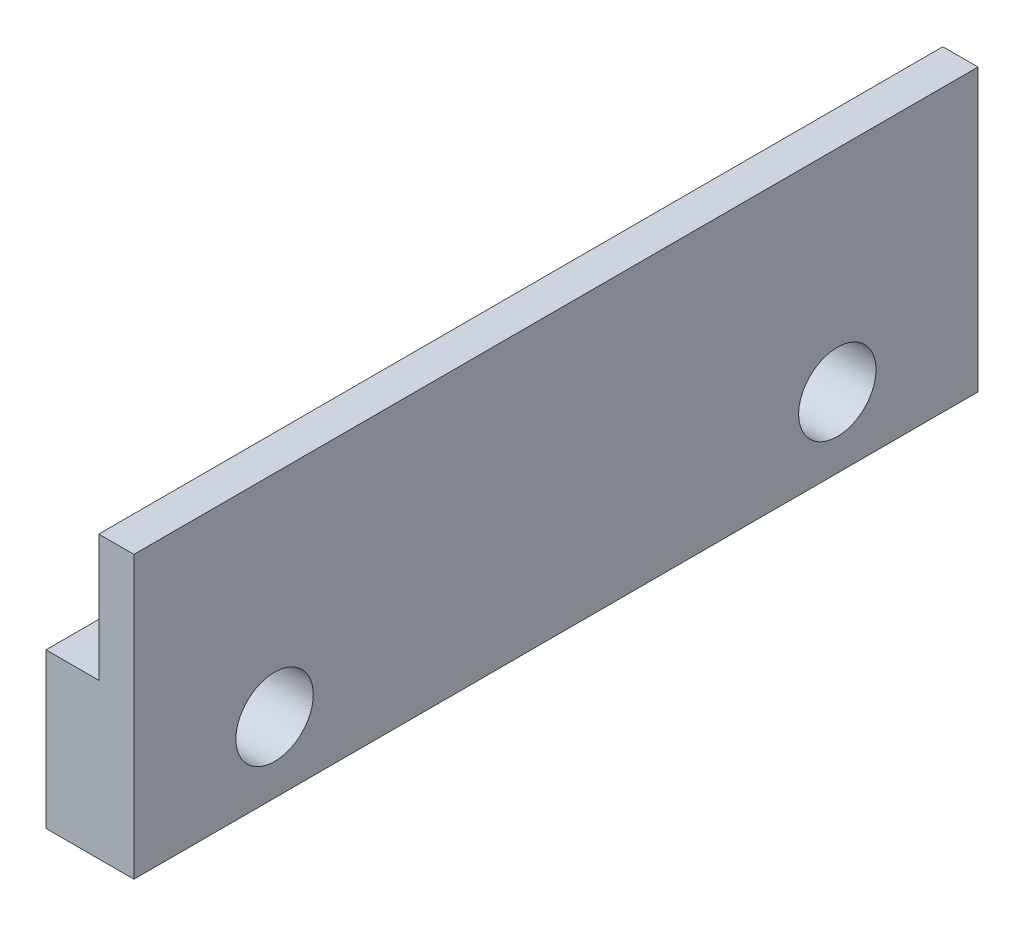
ISO-10303-21;
HEADER;
FILE_DESCRIPTION(('STEP AP214'),'2;1');
FILE_NAME('part.step','',(''),(''),'','','');
FILE_SCHEMA(('AUTOMOTIVE_DESIGN { 1 0 10303 214 1 1 1 1 }'));
ENDSEC;
DATA;
#1=APPLICATION_CONTEXT('core data for automotive mechanical design processes');
#2=APPLICATION_PROTOCOL_DEFINITION('international standard','automotive_design',2000,#1);
#3=PRODUCT_CONTEXT('',#1,'mechanical');
#4=PRODUCT('Part','Part','',(#3));
#5=PRODUCT_RELATED_PRODUCT_CATEGORY('part','',(#4));
#6=PRODUCT_DEFINITION_FORMATION('','',#4);
#7=PRODUCT_DEFINITION_CONTEXT('part definition',#1,'design');
#8=PRODUCT_DEFINITION('design','',#6,#7);
#9=PRODUCT_DEFINITION_SHAPE('','',#8);
#10=(LENGTH_UNIT() NAMED_UNIT(*) SI_UNIT(.MILLI.,.METRE.));
#11=(NAMED_UNIT(*) PLANE_ANGLE_UNIT() SI_UNIT($,.RADIAN.));
#12=(NAMED_UNIT(*) SI_UNIT($,.STERADIAN.) SOLID_ANGLE_UNIT());
#13=UNCERTAINTY_MEASURE_WITH_UNIT(LENGTH_MEASURE(1.E-05),#10,'distance_accuracy_value','');
#14=(GEOMETRIC_REPRESENTATION_CONTEXT(3) GLOBAL_UNCERTAINTY_ASSIGNED_CONTEXT((#13)) GLOBAL_UNIT_ASSIGNED_CONTEXT((#10,
#11,#12)) REPRESENTATION_CONTEXT('',''));
#15=CARTESIAN_POINT('',(0.,0.,0.));
#16=DIRECTION('',(0.,0.,1.));
#17=DIRECTION('',(1.,0.,0.));
#18=AXIS2_PLACEMENT_3D('',#15,#16,#17);
#19=CARTESIAN_POINT('',(6.35,17.2640625,152.4));
#20=DIRECTION('',(-1.,0.,0.));
#21=DIRECTION('',(0.,-1.,0.));
#22=AXIS2_PLACEMENT_3D('',#19,#20,#21);
#23=PLANE('',#22);
#24=CARTESIAN_POINT('',(6.35000000000001,-20.8359375,127.));
#25=DIRECTION('',(1.,0.,0.));
#26=DIRECTION('',(0.,1.,0.));
#27=AXIS2_PLACEMENT_3D('',#24,#25,#26);
#28=CIRCLE('',#27,6.985);
#29=CARTESIAN_POINT('',(6.35000000000001,-13.8509375,127.));
#30=VERTEX_POINT('',#29);
#31=EDGE_CURVE('E182',#30,#30,#28,.T.);
#32=ORIENTED_EDGE('',*,*,#31,.F.);
#33=EDGE_LOOP('',(#32));
#34=FACE_BOUND('',#33,.T.);
#35=CARTESIAN_POINT('',(6.35000000000001,-20.8359375,25.4000000000001));
#36=DIRECTION('',(1.,0.,0.));
#37=DIRECTION('',(0.,-1.,0.));
#38=AXIS2_PLACEMENT_3D('',#35,#36,#37);
#39=CIRCLE('',#38,6.985);
#40=CARTESIAN_POINT('',(6.35000000000001,-27.8209375,25.4000000000001));
#41=VERTEX_POINT('',#40);
#42=EDGE_CURVE('E185',#41,#41,#39,.T.);
#43=ORIENTED_EDGE('',*,*,#42,.F.);
#44=EDGE_LOOP('',(#43));
#45=FACE_BOUND('',#44,.T.);
#46=DIRECTION('',(0.,1.,0.));
#47=VECTOR('',#46,1.);
#48=CARTESIAN_POINT('',(6.35,17.2640625,0.));
#49=LINE('',#48,#47);
#50=CARTESIAN_POINT('',(6.35000000000001,-33.5359375,0.));
#51=VERTEX_POINT('',#50);
#52=CARTESIAN_POINT('',(6.35,17.2640625,0.));
#53=VERTEX_POINT('',#52);
#54=EDGE_CURVE('E128',#51,#53,#49,.T.);
#55=ORIENTED_EDGE('',*,*,#54,.T.);
#56=DIRECTION('',(0.,0.,-1.));
#57=VECTOR('',#56,1.);
#58=CARTESIAN_POINT('',(6.35,17.2640625,152.4));
#59=LINE('',#58,#57);
#60=CARTESIAN_POINT('',(6.35,17.2640625,152.4));
#61=VERTEX_POINT('',#60);
#62=EDGE_CURVE('E11',#61,#53,#59,.T.);
#63=ORIENTED_EDGE('',*,*,#62,.F.);
#64=DIRECTION('',(0.,1.,0.));
#65=VECTOR('',#64,1.);
#66=CARTESIAN_POINT('',(6.35,17.2640625,152.4));
#67=LINE('',#66,#65);
#68=CARTESIAN_POINT('',(6.35000000000001,-33.5359375,152.4));
#69=VERTEX_POINT('',#68);
#70=EDGE_CURVE('E145',#69,#61,#67,.T.);
#71=ORIENTED_EDGE('',*,*,#70,.F.);
#72=DIRECTION('',(0.,0.,-1.));
#73=VECTOR('',#72,1.);
#74=CARTESIAN_POINT('',(6.35000000000001,-33.5359375,152.4));
#75=LINE('',#74,#73);
#76=EDGE_CURVE('E124',#69,#51,#75,.T.);
#77=ORIENTED_EDGE('',*,*,#76,.T.);
#78=EDGE_LOOP('',(#55,#63,#71,#77));
#79=FACE_BOUND('',#78,.T.);
#80=ADVANCED_FACE('F39',(#34,#45,#79),#23,.F.);
#81=CARTESIAN_POINT('',(0.,17.2640625,152.4));
#82=DIRECTION('',(0.,-1.,0.));
#83=DIRECTION('',(0.,0.,-1.));
#84=AXIS2_PLACEMENT_3D('',#81,#82,#83);
#85=PLANE('',#84);
#86=DIRECTION('',(-1.,0.,0.));
#87=VECTOR('',#86,1.);
#88=CARTESIAN_POINT('',(0.,17.2640625,0.));
#89=LINE('',#88,#87);
#90=CARTESIAN_POINT('',(0.,17.2640625,0.));
#91=VERTEX_POINT('',#90);
#92=EDGE_CURVE('E132',#53,#91,#89,.T.);
#93=ORIENTED_EDGE('',*,*,#92,.T.);
#94=DIRECTION('',(0.,0.,-1.));
#95=VECTOR('',#94,1.);
#96=CARTESIAN_POINT('',(0.,17.2640625,152.4));
#97=LINE('',#96,#95);
#98=CARTESIAN_POINT('',(0.,17.2640625,152.4));
#99=VERTEX_POINT('',#98);
#100=EDGE_CURVE('E48',#99,#91,#97,.T.);
#101=ORIENTED_EDGE('',*,*,#100,.F.);
#102=DIRECTION('',(-1.,0.,0.));
#103=VECTOR('',#102,1.);
#104=CARTESIAN_POINT('',(0.,17.2640625,152.4));
#105=LINE('',#104,#103);
#106=EDGE_CURVE('E93',#61,#99,#105,.T.);
#107=ORIENTED_EDGE('',*,*,#106,.F.);
#108=ORIENTED_EDGE('',*,*,#62,.T.);
#109=EDGE_LOOP('',(#93,#101,#107,#108));
#110=FACE_BOUND('',#109,.T.);
#111=ADVANCED_FACE('F174',(#110),#85,.F.);
#112=CARTESIAN_POINT('',(0.,17.2640625,152.4));
#113=DIRECTION('',(1.,0.,0.));
#114=DIRECTION('',(0.,1.,0.));
#115=AXIS2_PLACEMENT_3D('',#112,#113,#114);
#116=PLANE('',#115);
#117=DIRECTION('',(0.,-1.,0.));
#118=VECTOR('',#117,1.);
#119=CARTESIAN_POINT('',(0.,17.2640625,0.));
#120=LINE('',#119,#118);
#121=CARTESIAN_POINT('',(0.,-5.59593749999998,0.));
#122=VERTEX_POINT('',#121);
#123=EDGE_CURVE('E136',#91,#122,#120,.T.);
#124=ORIENTED_EDGE('',*,*,#123,.T.);
#125=DIRECTION('',(0.,0.,-1.));
#126=VECTOR('',#125,1.);
#127=CARTESIAN_POINT('',(0.,-5.59593749999998,152.4));
#128=LINE('',#127,#126);
#129=CARTESIAN_POINT('',(0.,-5.59593749999998,152.4));
#130=VERTEX_POINT('',#129);
#131=EDGE_CURVE('E117',#130,#122,#128,.T.);
#132=ORIENTED_EDGE('',*,*,#131,.F.);
#133=DIRECTION('',(0.,-1.,0.));
#134=VECTOR('',#133,1.);
#135=CARTESIAN_POINT('',(0.,17.2640625,152.4));
#136=LINE('',#135,#134);
#137=EDGE_CURVE('E106',#99,#130,#136,.T.);
#138=ORIENTED_EDGE('',*,*,#137,.F.);
#139=ORIENTED_EDGE('',*,*,#100,.T.);
#140=EDGE_LOOP('',(#124,#132,#138,#139));
#141=FACE_BOUND('',#140,.T.);
#142=ADVANCED_FACE('F155',(#141),#116,.F.);
#143=CARTESIAN_POINT('',(0.,-5.59593749999998,152.4));
#144=DIRECTION('',(0.,-1.,0.));
#145=DIRECTION('',(1.,0.,0.));
#146=AXIS2_PLACEMENT_3D('',#143,#144,#145);
#147=PLANE('',#146);
#148=DIRECTION('',(-1.,0.,0.));
#149=VECTOR('',#148,1.);
#150=CARTESIAN_POINT('',(0.,-5.59593749999998,0.));
#151=LINE('',#150,#149);
#152=CARTESIAN_POINT('',(-9.525,-5.59593749999998,0.));
#153=VERTEX_POINT('',#152);
#154=EDGE_CURVE('E115',#122,#153,#151,.T.);
#155=ORIENTED_EDGE('',*,*,#154,.T.);
#156=DIRECTION('',(0.,0.,-1.));
#157=VECTOR('',#156,1.);
#158=CARTESIAN_POINT('',(-9.525,-5.59593749999998,152.4));
#159=LINE('',#158,#157);
#160=CARTESIAN_POINT('',(-9.525,-5.59593749999998,152.4));
#161=VERTEX_POINT('',#160);
#162=EDGE_CURVE('E112',#161,#153,#159,.T.);
#163=ORIENTED_EDGE('',*,*,#162,.F.);
#164=DIRECTION('',(-1.,0.,0.));
#165=VECTOR('',#164,1.);
#166=CARTESIAN_POINT('',(0.,-5.59593749999998,152.4));
#167=LINE('',#166,#165);
#168=EDGE_CURVE('E100',#130,#161,#167,.T.);
#169=ORIENTED_EDGE('',*,*,#168,.F.);
#170=ORIENTED_EDGE('',*,*,#131,.T.);
#171=EDGE_LOOP('',(#155,#163,#169,#170));
#172=FACE_BOUND('',#171,.T.);
#173=ADVANCED_FACE('F113',(#172),#147,.F.);
#174=CARTESIAN_POINT('',(-9.525,-5.59593749999998,152.4));
#175=DIRECTION('',(1.,0.,0.));
#176=DIRECTION('',(0.,1.,0.));
#177=AXIS2_PLACEMENT_3D('',#174,#175,#176);
#178=PLANE('',#177);
#179=CARTESIAN_POINT('',(-9.52499999999999,-20.8359375,127.));
#180=DIRECTION('',(1.,0.,0.));
#181=DIRECTION('',(0.,1.,0.));
#182=AXIS2_PLACEMENT_3D('',#179,#180,#181);
#183=CIRCLE('',#182,6.985);
#184=CARTESIAN_POINT('',(-9.52499999999999,-13.8509375,127.));
#185=VERTEX_POINT('',#184);
#186=EDGE_CURVE('E133',#185,#185,#183,.T.);
#187=ORIENTED_EDGE('',*,*,#186,.T.);
#188=EDGE_LOOP('',(#187));
#189=FACE_BOUND('',#188,.T.);
#190=CARTESIAN_POINT('',(-9.52499999999999,-20.8359375,25.4000000000001));
#191=DIRECTION('',(1.,0.,0.));
#192=DIRECTION('',(0.,-1.,0.));
#193=AXIS2_PLACEMENT_3D('',#190,#191,#192);
#194=CIRCLE('',#193,6.985);
#195=CARTESIAN_POINT('',(-9.52499999999999,-27.8209375,25.4000000000001));
#196=VERTEX_POINT('',#195);
#197=EDGE_CURVE('E188',#196,#196,#194,.T.);
#198=ORIENTED_EDGE('',*,*,#197,.T.);
#199=EDGE_LOOP('',(#198));
#200=FACE_BOUND('',#199,.T.);
#201=DIRECTION('',(0.,-1.,0.));
#202=VECTOR('',#201,1.);
#203=CARTESIAN_POINT('',(-9.525,-5.59593749999998,0.));
#204=LINE('',#203,#202);
#205=CARTESIAN_POINT('',(-9.525,-33.5359375,0.));
#206=VERTEX_POINT('',#205);
#207=EDGE_CURVE('E79',#153,#206,#204,.T.);
#208=ORIENTED_EDGE('',*,*,#207,.T.);
#209=DIRECTION('',(0.,0.,-1.));
#210=VECTOR('',#209,1.);
#211=CARTESIAN_POINT('',(-9.525,-33.5359375,152.4));
#212=LINE('',#211,#210);
#213=CARTESIAN_POINT('',(-9.525,-33.5359375,152.4));
#214=VERTEX_POINT('',#213);
#215=EDGE_CURVE('E118',#214,#206,#212,.T.);
#216=ORIENTED_EDGE('',*,*,#215,.F.);
#217=DIRECTION('',(0.,-1.,0.));
#218=VECTOR('',#217,1.);
#219=CARTESIAN_POINT('',(-9.525,-5.59593749999998,152.4));
#220=LINE('',#219,#218);
#221=EDGE_CURVE('E104',#161,#214,#220,.T.);
#222=ORIENTED_EDGE('',*,*,#221,.F.);
#223=ORIENTED_EDGE('',*,*,#162,.T.);
#224=EDGE_LOOP('',(#208,#216,#222,#223));
#225=FACE_BOUND('',#224,.T.);
#226=ADVANCED_FACE('F120',(#189,#200,#225),#178,.F.);
#227=CARTESIAN_POINT('',(-9.525,-33.5359375,152.4));
#228=DIRECTION('',(0.,1.,0.));
#229=DIRECTION('',(0.,0.,1.));
#230=AXIS2_PLACEMENT_3D('',#227,#228,#229);
#231=PLANE('',#230);
#232=DIRECTION('',(1.,0.,0.));
#233=VECTOR('',#232,1.);
#234=CARTESIAN_POINT('',(-9.525,-33.5359375,0.));
#235=LINE('',#234,#233);
#236=EDGE_CURVE('E85',#206,#51,#235,.T.);
#237=ORIENTED_EDGE('',*,*,#236,.T.);
#238=ORIENTED_EDGE('',*,*,#76,.F.);
#239=DIRECTION('',(1.,0.,0.));
#240=VECTOR('',#239,1.);
#241=CARTESIAN_POINT('',(-9.525,-33.5359375,152.4));
#242=LINE('',#241,#240);
#243=EDGE_CURVE('E56',#214,#69,#242,.T.);
#244=ORIENTED_EDGE('',*,*,#243,.F.);
#245=ORIENTED_EDGE('',*,*,#215,.T.);
#246=EDGE_LOOP('',(#237,#238,#244,#245));
#247=FACE_BOUND('',#246,.T.);
#248=ADVANCED_FACE('F162',(#247),#231,.F.);
#249=CARTESIAN_POINT('',(0.,0.,152.4));
#250=DIRECTION('',(0.,0.,1.));
#251=DIRECTION('',(1.,0.,0.));
#252=AXIS2_PLACEMENT_3D('',#249,#250,#251);
#253=PLANE('',#252);
#254=ORIENTED_EDGE('',*,*,#70,.T.);
#255=ORIENTED_EDGE('',*,*,#106,.T.);
#256=ORIENTED_EDGE('',*,*,#137,.T.);
#257=ORIENTED_EDGE('',*,*,#168,.T.);
#258=ORIENTED_EDGE('',*,*,#221,.T.);
#259=ORIENTED_EDGE('',*,*,#243,.T.);
#260=EDGE_LOOP('',(#254,#255,#256,#257,#258,#259));
#261=FACE_BOUND('',#260,.T.);
#262=ADVANCED_FACE('F102',(#261),#253,.T.);
#263=CARTESIAN_POINT('',(0.,0.,0.));
#264=DIRECTION('',(0.,0.,1.));
#265=DIRECTION('',(1.,0.,0.));
#266=AXIS2_PLACEMENT_3D('',#263,#264,#265);
#267=PLANE('',#266);
#268=ORIENTED_EDGE('',*,*,#54,.F.);
#269=ORIENTED_EDGE('',*,*,#236,.F.);
#270=ORIENTED_EDGE('',*,*,#207,.F.);
#271=ORIENTED_EDGE('',*,*,#154,.F.);
#272=ORIENTED_EDGE('',*,*,#123,.F.);
#273=ORIENTED_EDGE('',*,*,#92,.F.);
#274=EDGE_LOOP('',(#268,#269,#270,#271,#272,#273));
#275=FACE_BOUND('',#274,.T.);
#276=ADVANCED_FACE('F158',(#275),#267,.F.);
#277=CARTESIAN_POINT('',(-9.52499999999999,-20.8359375,25.4000000000001));
#278=DIRECTION('',(1.,0.,0.));
#279=DIRECTION('',(0.,1.,0.));
#280=AXIS2_PLACEMENT_3D('',#277,#278,#279);
#281=CYLINDRICAL_SURFACE('',#280,6.985);
#282=ORIENTED_EDGE('',*,*,#197,.F.);
#283=EDGE_LOOP('',(#282));
#284=FACE_BOUND('',#283,.T.);
#285=ORIENTED_EDGE('',*,*,#42,.T.);
#286=EDGE_LOOP('',(#285));
#287=FACE_BOUND('',#286,.T.);
#288=ADVANCED_FACE('F206',(#284,#287),#281,.F.);
#289=CARTESIAN_POINT('',(-9.52499999999999,-20.8359375,127.));
#290=DIRECTION('',(1.,0.,0.));
#291=DIRECTION('',(0.,1.,0.));
#292=AXIS2_PLACEMENT_3D('',#289,#290,#291);
#293=CYLINDRICAL_SURFACE('',#292,6.985);
#294=ORIENTED_EDGE('',*,*,#186,.F.);
#295=EDGE_LOOP('',(#294));
#296=FACE_BOUND('',#295,.T.);
#297=ORIENTED_EDGE('',*,*,#31,.T.);
#298=EDGE_LOOP('',(#297));
#299=FACE_BOUND('',#298,.T.);
#300=ADVANCED_FACE('F204',(#296,#299),#293,.F.);
#301=CLOSED_SHELL('',(#80,#111,#142,#173,#226,#248,#262,#276,#288,#300));
#302=MANIFOLD_SOLID_BREP('B2',#301);
#303=ADVANCED_BREP_SHAPE_REPRESENTATION('',(#18,#302),#14);
#304=SHAPE_DEFINITION_REPRESENTATION(#9,#303);
ENDSEC;
END-ISO-10303-21;
